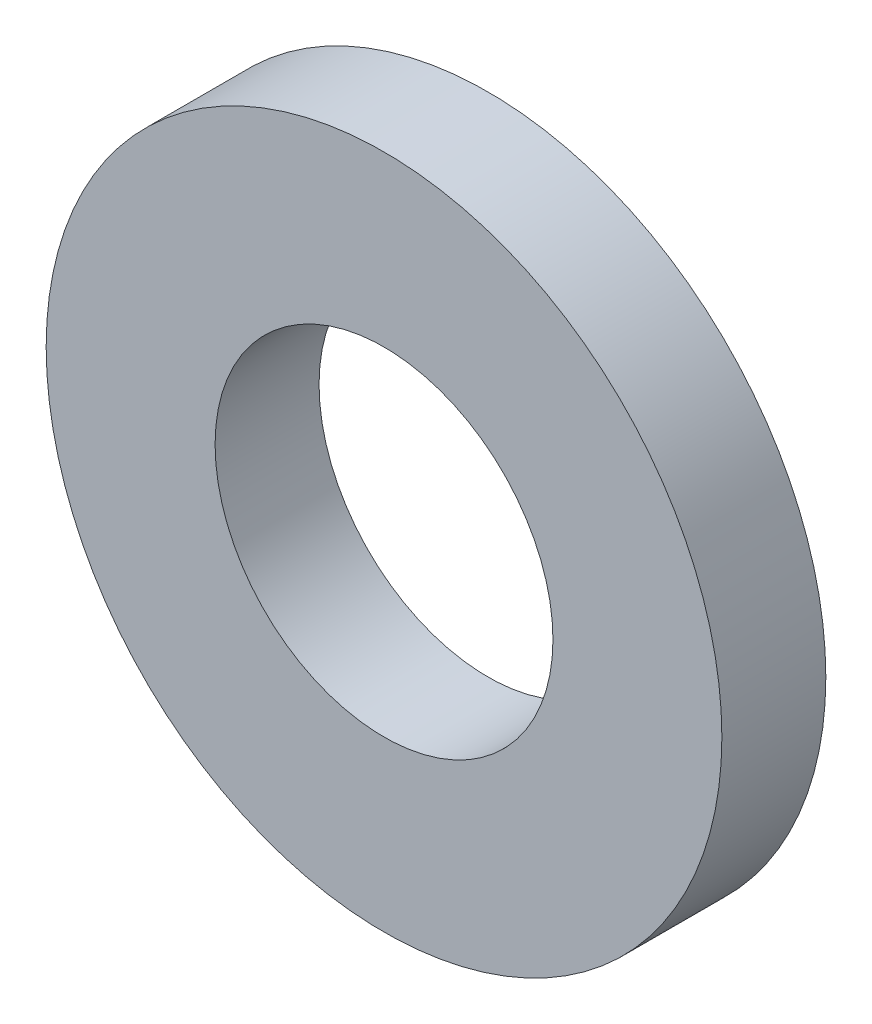
ISO-10303-21;
HEADER;
FILE_DESCRIPTION(('STEP AP214'),'2;1');
FILE_NAME('part.step','',(''),(''),'','','');
FILE_SCHEMA(('AUTOMOTIVE_DESIGN { 1 0 10303 214 1 1 1 1 }'));
ENDSEC;
DATA;
#1=APPLICATION_CONTEXT('core data for automotive mechanical design processes');
#2=APPLICATION_PROTOCOL_DEFINITION('international standard','automotive_design',2000,#1);
#3=PRODUCT_CONTEXT('',#1,'mechanical');
#4=PRODUCT('Part','Part','',(#3));
#5=PRODUCT_RELATED_PRODUCT_CATEGORY('part','',(#4));
#6=PRODUCT_DEFINITION_FORMATION('','',#4);
#7=PRODUCT_DEFINITION_CONTEXT('part definition',#1,'design');
#8=PRODUCT_DEFINITION('design','',#6,#7);
#9=PRODUCT_DEFINITION_SHAPE('','',#8);
#10=(LENGTH_UNIT() NAMED_UNIT(*) SI_UNIT(.MILLI.,.METRE.));
#11=(NAMED_UNIT(*) PLANE_ANGLE_UNIT() SI_UNIT($,.RADIAN.));
#12=(NAMED_UNIT(*) SI_UNIT($,.STERADIAN.) SOLID_ANGLE_UNIT());
#13=UNCERTAINTY_MEASURE_WITH_UNIT(LENGTH_MEASURE(1.E-05),#10,'distance_accuracy_value','');
#14=(GEOMETRIC_REPRESENTATION_CONTEXT(3) GLOBAL_UNCERTAINTY_ASSIGNED_CONTEXT((#13)) GLOBAL_UNIT_ASSIGNED_CONTEXT((#10,
#11,#12)) REPRESENTATION_CONTEXT('',''));
#15=CARTESIAN_POINT('',(0.,0.,0.));
#16=DIRECTION('',(0.,0.,1.));
#17=DIRECTION('',(1.,0.,0.));
#18=AXIS2_PLACEMENT_3D('',#15,#16,#17);
#19=CARTESIAN_POINT('',(0.,0.,2.));
#20=DIRECTION('',(0.,0.,1.));
#21=DIRECTION('',(1.,0.,0.));
#22=AXIS2_PLACEMENT_3D('',#19,#20,#21);
#23=PLANE('',#22);
#24=CARTESIAN_POINT('',(0.,0.,2.));
#25=DIRECTION('',(0.,0.,1.));
#26=DIRECTION('',(1.,0.,0.));
#27=AXIS2_PLACEMENT_3D('',#24,#25,#26);
#28=CIRCLE('',#27,6.5);
#29=CARTESIAN_POINT('',(6.5,0.,2.));
#30=VERTEX_POINT('',#29);
#31=EDGE_CURVE('E10',#30,#30,#28,.T.);
#32=ORIENTED_EDGE('',*,*,#31,.T.);
#33=EDGE_LOOP('',(#32));
#34=FACE_BOUND('',#33,.T.);
#35=CARTESIAN_POINT('',(0.,0.,2.));
#36=DIRECTION('',(0.,0.,1.));
#37=DIRECTION('',(1.,0.,0.));
#38=AXIS2_PLACEMENT_3D('',#35,#36,#37);
#39=CIRCLE('',#38,3.25);
#40=CARTESIAN_POINT('',(3.25,0.,2.));
#41=VERTEX_POINT('',#40);
#42=EDGE_CURVE('E53',#41,#41,#39,.T.);
#43=ORIENTED_EDGE('',*,*,#42,.F.);
#44=EDGE_LOOP('',(#43));
#45=FACE_BOUND('',#44,.T.);
#46=ADVANCED_FACE('F40',(#34,#45),#23,.T.);
#47=CARTESIAN_POINT('',(0.,0.,0.));
#48=DIRECTION('',(0.,0.,1.));
#49=DIRECTION('',(1.,0.,0.));
#50=AXIS2_PLACEMENT_3D('',#47,#48,#49);
#51=PLANE('',#50);
#52=CARTESIAN_POINT('',(0.,0.,0.));
#53=DIRECTION('',(0.,0.,1.));
#54=DIRECTION('',(1.,0.,0.));
#55=AXIS2_PLACEMENT_3D('',#52,#53,#54);
#56=CIRCLE('',#55,6.5);
#57=CARTESIAN_POINT('',(6.5,0.,0.));
#58=VERTEX_POINT('',#57);
#59=EDGE_CURVE('E44',#58,#58,#56,.T.);
#60=ORIENTED_EDGE('',*,*,#59,.F.);
#61=EDGE_LOOP('',(#60));
#62=FACE_BOUND('',#61,.T.);
#63=CARTESIAN_POINT('',(0.,0.,0.));
#64=DIRECTION('',(0.,0.,1.));
#65=DIRECTION('',(1.,0.,0.));
#66=AXIS2_PLACEMENT_3D('',#63,#64,#65);
#67=CIRCLE('',#66,3.25);
#68=CARTESIAN_POINT('',(3.25,0.,0.));
#69=VERTEX_POINT('',#68);
#70=EDGE_CURVE('E55',#69,#69,#67,.T.);
#71=ORIENTED_EDGE('',*,*,#70,.T.);
#72=EDGE_LOOP('',(#71));
#73=FACE_BOUND('',#72,.T.);
#74=ADVANCED_FACE('F67',(#62,#73),#51,.F.);
#75=CARTESIAN_POINT('',(0.,0.,2.));
#76=DIRECTION('',(0.,0.,-1.));
#77=DIRECTION('',(-1.,0.,0.));
#78=AXIS2_PLACEMENT_3D('',#75,#76,#77);
#79=CYLINDRICAL_SURFACE('',#78,6.5);
#80=ORIENTED_EDGE('',*,*,#31,.F.);
#81=EDGE_LOOP('',(#80));
#82=FACE_BOUND('',#81,.T.);
#83=ORIENTED_EDGE('',*,*,#59,.T.);
#84=EDGE_LOOP('',(#83));
#85=FACE_BOUND('',#84,.T.);
#86=ADVANCED_FACE('F42',(#82,#85),#79,.T.);
#87=CARTESIAN_POINT('',(0.,0.,2.));
#88=DIRECTION('',(0.,0.,-1.));
#89=DIRECTION('',(-1.,0.,0.));
#90=AXIS2_PLACEMENT_3D('',#87,#88,#89);
#91=CYLINDRICAL_SURFACE('',#90,3.25);
#92=ORIENTED_EDGE('',*,*,#42,.T.);
#93=EDGE_LOOP('',(#92));
#94=FACE_BOUND('',#93,.T.);
#95=ORIENTED_EDGE('',*,*,#70,.F.);
#96=EDGE_LOOP('',(#95));
#97=FACE_BOUND('',#96,.T.);
#98=ADVANCED_FACE('F63',(#94,#97),#91,.F.);
#99=CLOSED_SHELL('',(#46,#74,#86,#98));
#100=MANIFOLD_SOLID_BREP('B2',#99);
#101=ADVANCED_BREP_SHAPE_REPRESENTATION('',(#18,#100),#14);
#102=SHAPE_DEFINITION_REPRESENTATION(#9,#101);
ENDSEC;
END-ISO-10303-21;
